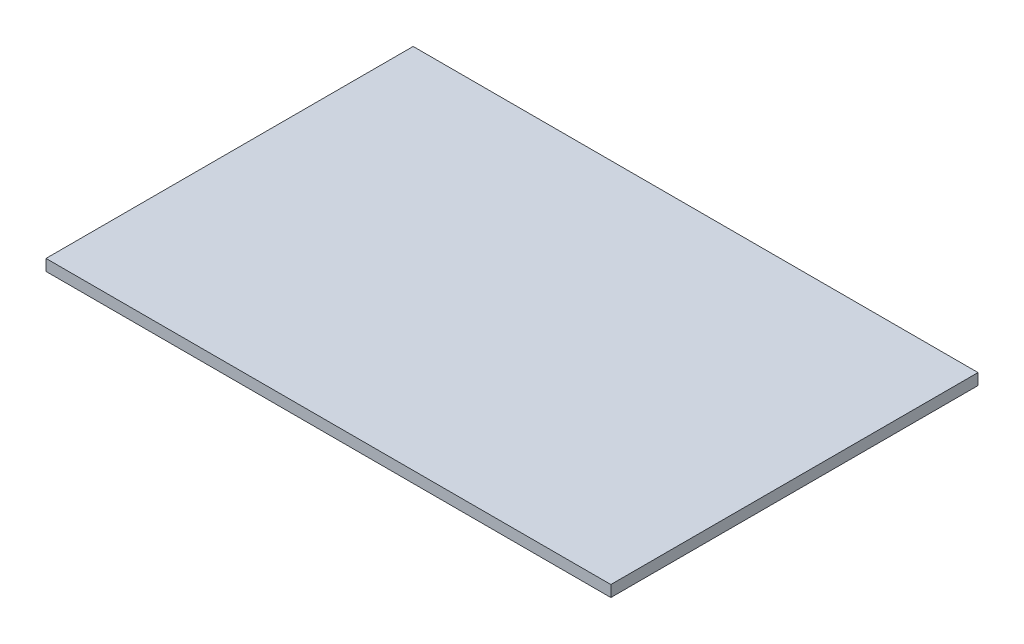
ISO-10303-21;
HEADER;
FILE_DESCRIPTION(('STEP AP214'),'2;1');
FILE_NAME('part.step','',(''),(''),'','','');
FILE_SCHEMA(('AUTOMOTIVE_DESIGN { 1 0 10303 214 1 1 1 1 }'));
ENDSEC;
DATA;
#1=APPLICATION_CONTEXT('core data for automotive mechanical design processes');
#2=APPLICATION_PROTOCOL_DEFINITION('international standard','automotive_design',2000,#1);
#3=PRODUCT_CONTEXT('',#1,'mechanical');
#4=PRODUCT('Part','Part','',(#3));
#5=PRODUCT_RELATED_PRODUCT_CATEGORY('part','',(#4));
#6=PRODUCT_DEFINITION_FORMATION('','',#4);
#7=PRODUCT_DEFINITION_CONTEXT('part definition',#1,'design');
#8=PRODUCT_DEFINITION('design','',#6,#7);
#9=PRODUCT_DEFINITION_SHAPE('','',#8);
#10=(LENGTH_UNIT() NAMED_UNIT(*) SI_UNIT(.MILLI.,.METRE.));
#11=(NAMED_UNIT(*) PLANE_ANGLE_UNIT() SI_UNIT($,.RADIAN.));
#12=(NAMED_UNIT(*) SI_UNIT($,.STERADIAN.) SOLID_ANGLE_UNIT());
#13=UNCERTAINTY_MEASURE_WITH_UNIT(LENGTH_MEASURE(1.E-05),#10,'distance_accuracy_value','');
#14=(GEOMETRIC_REPRESENTATION_CONTEXT(3) GLOBAL_UNCERTAINTY_ASSIGNED_CONTEXT((#13)) GLOBAL_UNIT_ASSIGNED_CONTEXT((#10,
#11,#12)) REPRESENTATION_CONTEXT('',''));
#15=CARTESIAN_POINT('',(0.,0.,0.));
#16=DIRECTION('',(0.,0.,1.));
#17=DIRECTION('',(1.,0.,0.));
#18=AXIS2_PLACEMENT_3D('',#15,#16,#17);
#19=CARTESIAN_POINT('',(100.,4.,65.));
#20=DIRECTION('',(-1.,0.,0.));
#21=DIRECTION('',(0.,0.,1.));
#22=AXIS2_PLACEMENT_3D('',#19,#20,#21);
#23=PLANE('',#22);
#24=DIRECTION('',(0.,0.,-1.));
#25=VECTOR('',#24,1.);
#26=CARTESIAN_POINT('',(100.,0.,65.));
#27=LINE('',#26,#25);
#28=CARTESIAN_POINT('',(100.,0.,65.));
#29=VERTEX_POINT('',#28);
#30=CARTESIAN_POINT('',(100.,0.,-65.));
#31=VERTEX_POINT('',#30);
#32=EDGE_CURVE('E96',#29,#31,#27,.T.);
#33=ORIENTED_EDGE('',*,*,#32,.T.);
#34=DIRECTION('',(0.,-1.,0.));
#35=VECTOR('',#34,1.);
#36=CARTESIAN_POINT('',(100.,4.,-65.));
#37=LINE('',#36,#35);
#38=CARTESIAN_POINT('',(100.,4.,-65.));
#39=VERTEX_POINT('',#38);
#40=EDGE_CURVE('E11',#39,#31,#37,.T.);
#41=ORIENTED_EDGE('',*,*,#40,.F.);
#42=DIRECTION('',(0.,0.,-1.));
#43=VECTOR('',#42,1.);
#44=CARTESIAN_POINT('',(100.,4.,65.));
#45=LINE('',#44,#43);
#46=CARTESIAN_POINT('',(100.,4.,65.));
#47=VERTEX_POINT('',#46);
#48=EDGE_CURVE('E84',#47,#39,#45,.T.);
#49=ORIENTED_EDGE('',*,*,#48,.F.);
#50=DIRECTION('',(0.,-1.,0.));
#51=VECTOR('',#50,1.);
#52=CARTESIAN_POINT('',(100.,4.,65.));
#53=LINE('',#52,#51);
#54=EDGE_CURVE('E92',#47,#29,#53,.T.);
#55=ORIENTED_EDGE('',*,*,#54,.T.);
#56=EDGE_LOOP('',(#33,#41,#49,#55));
#57=FACE_BOUND('',#56,.T.);
#58=ADVANCED_FACE('F33',(#57),#23,.F.);
#59=CARTESIAN_POINT('',(-100.,4.,-65.));
#60=DIRECTION('',(0.,0.,1.));
#61=DIRECTION('',(1.,0.,0.));
#62=AXIS2_PLACEMENT_3D('',#59,#60,#61);
#63=PLANE('',#62);
#64=DIRECTION('',(-1.,0.,0.));
#65=VECTOR('',#64,1.);
#66=CARTESIAN_POINT('',(-100.,0.,-65.));
#67=LINE('',#66,#65);
#68=CARTESIAN_POINT('',(-100.,0.,-65.));
#69=VERTEX_POINT('',#68);
#70=EDGE_CURVE('E88',#31,#69,#67,.T.);
#71=ORIENTED_EDGE('',*,*,#70,.T.);
#72=DIRECTION('',(0.,-1.,0.));
#73=VECTOR('',#72,1.);
#74=CARTESIAN_POINT('',(-100.,4.,-65.));
#75=LINE('',#74,#73);
#76=CARTESIAN_POINT('',(-100.,4.,-65.));
#77=VERTEX_POINT('',#76);
#78=EDGE_CURVE('E41',#77,#69,#75,.T.);
#79=ORIENTED_EDGE('',*,*,#78,.F.);
#80=DIRECTION('',(-1.,0.,0.));
#81=VECTOR('',#80,1.);
#82=CARTESIAN_POINT('',(-100.,4.,-65.));
#83=LINE('',#82,#81);
#84=EDGE_CURVE('E79',#39,#77,#83,.T.);
#85=ORIENTED_EDGE('',*,*,#84,.F.);
#86=ORIENTED_EDGE('',*,*,#40,.T.);
#87=EDGE_LOOP('',(#71,#79,#85,#86));
#88=FACE_BOUND('',#87,.T.);
#89=ADVANCED_FACE('F87',(#88),#63,.F.);
#90=CARTESIAN_POINT('',(-100.,4.,65.));
#91=DIRECTION('',(1.,0.,0.));
#92=DIRECTION('',(0.,0.,-1.));
#93=AXIS2_PLACEMENT_3D('',#90,#91,#92);
#94=PLANE('',#93);
#95=DIRECTION('',(0.,0.,1.));
#96=VECTOR('',#95,1.);
#97=CARTESIAN_POINT('',(-100.,0.,65.));
#98=LINE('',#97,#96);
#99=CARTESIAN_POINT('',(-100.,0.,65.));
#100=VERTEX_POINT('',#99);
#101=EDGE_CURVE('E66',#69,#100,#98,.T.);
#102=ORIENTED_EDGE('',*,*,#101,.T.);
#103=DIRECTION('',(0.,-1.,0.));
#104=VECTOR('',#103,1.);
#105=CARTESIAN_POINT('',(-100.,4.,65.));
#106=LINE('',#105,#104);
#107=CARTESIAN_POINT('',(-100.,4.,65.));
#108=VERTEX_POINT('',#107);
#109=EDGE_CURVE('E89',#108,#100,#106,.T.);
#110=ORIENTED_EDGE('',*,*,#109,.F.);
#111=DIRECTION('',(0.,0.,1.));
#112=VECTOR('',#111,1.);
#113=CARTESIAN_POINT('',(-100.,4.,65.));
#114=LINE('',#113,#112);
#115=EDGE_CURVE('E82',#77,#108,#114,.T.);
#116=ORIENTED_EDGE('',*,*,#115,.F.);
#117=ORIENTED_EDGE('',*,*,#78,.T.);
#118=EDGE_LOOP('',(#102,#110,#116,#117));
#119=FACE_BOUND('',#118,.T.);
#120=ADVANCED_FACE('F90',(#119),#94,.F.);
#121=CARTESIAN_POINT('',(-100.,4.,65.));
#122=DIRECTION('',(0.,0.,-1.));
#123=DIRECTION('',(-1.,0.,0.));
#124=AXIS2_PLACEMENT_3D('',#121,#122,#123);
#125=PLANE('',#124);
#126=DIRECTION('',(1.,0.,0.));
#127=VECTOR('',#126,1.);
#128=CARTESIAN_POINT('',(-100.,0.,65.));
#129=LINE('',#128,#127);
#130=EDGE_CURVE('E72',#100,#29,#129,.T.);
#131=ORIENTED_EDGE('',*,*,#130,.T.);
#132=ORIENTED_EDGE('',*,*,#54,.F.);
#133=DIRECTION('',(1.,0.,0.));
#134=VECTOR('',#133,1.);
#135=CARTESIAN_POINT('',(-100.,4.,65.));
#136=LINE('',#135,#134);
#137=EDGE_CURVE('E49',#108,#47,#136,.T.);
#138=ORIENTED_EDGE('',*,*,#137,.F.);
#139=ORIENTED_EDGE('',*,*,#109,.T.);
#140=EDGE_LOOP('',(#131,#132,#138,#139));
#141=FACE_BOUND('',#140,.T.);
#142=ADVANCED_FACE('F103',(#141),#125,.F.);
#143=CARTESIAN_POINT('',(0.,4.,0.));
#144=DIRECTION('',(0.,-1.,0.));
#145=DIRECTION('',(0.,0.,-1.));
#146=AXIS2_PLACEMENT_3D('',#143,#144,#145);
#147=PLANE('',#146);
#148=ORIENTED_EDGE('',*,*,#48,.T.);
#149=ORIENTED_EDGE('',*,*,#84,.T.);
#150=ORIENTED_EDGE('',*,*,#115,.T.);
#151=ORIENTED_EDGE('',*,*,#137,.T.);
#152=EDGE_LOOP('',(#148,#149,#150,#151));
#153=FACE_BOUND('',#152,.T.);
#154=ADVANCED_FACE('F80',(#153),#147,.F.);
#155=CARTESIAN_POINT('',(0.,0.,0.));
#156=DIRECTION('',(0.,-1.,0.));
#157=DIRECTION('',(0.,0.,-1.));
#158=AXIS2_PLACEMENT_3D('',#155,#156,#157);
#159=PLANE('',#158);
#160=ORIENTED_EDGE('',*,*,#32,.F.);
#161=ORIENTED_EDGE('',*,*,#130,.F.);
#162=ORIENTED_EDGE('',*,*,#101,.F.);
#163=ORIENTED_EDGE('',*,*,#70,.F.);
#164=EDGE_LOOP('',(#160,#161,#162,#163));
#165=FACE_BOUND('',#164,.T.);
#166=ADVANCED_FACE('F106',(#165),#159,.T.);
#167=CLOSED_SHELL('',(#58,#89,#120,#142,#154,#166));
#168=MANIFOLD_SOLID_BREP('B2',#167);
#169=ADVANCED_BREP_SHAPE_REPRESENTATION('',(#18,#168),#14);
#170=SHAPE_DEFINITION_REPRESENTATION(#9,#169);
ENDSEC;
END-ISO-10303-21;
